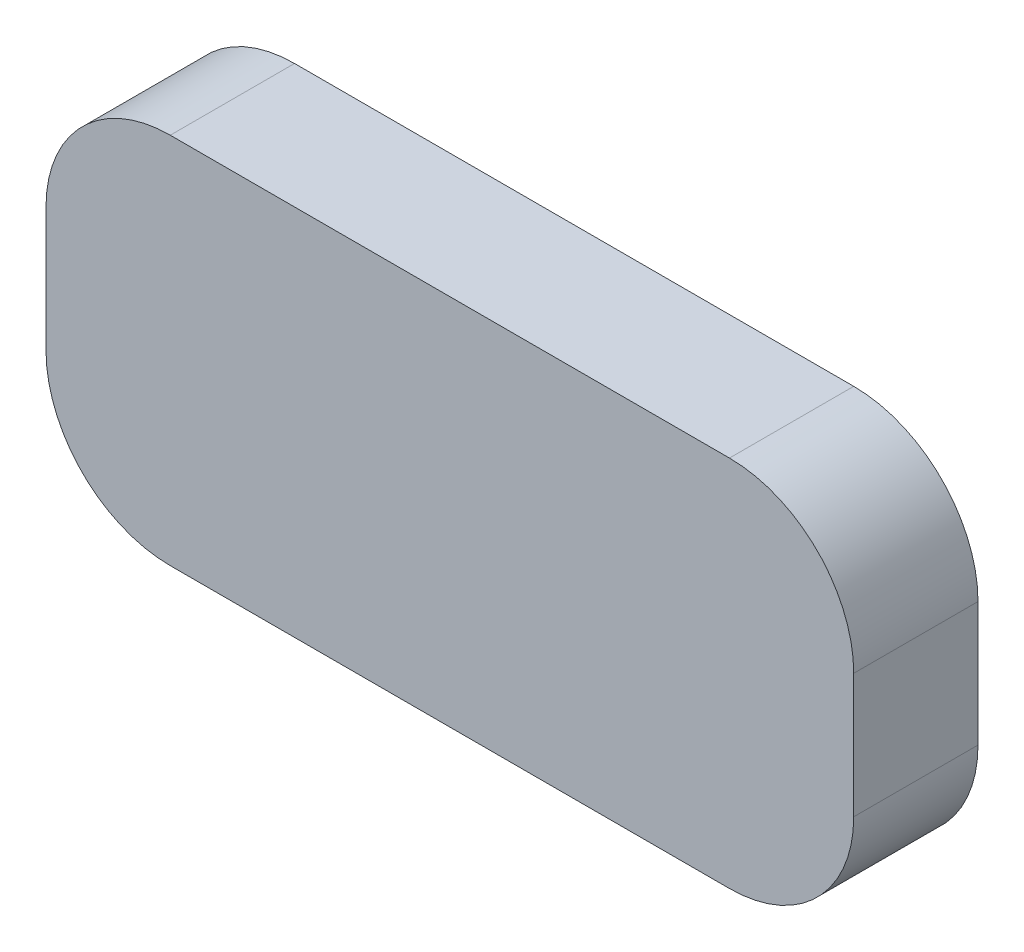
ISO-10303-21;
HEADER;
FILE_DESCRIPTION(('STEP AP214'),'2;1');
FILE_NAME('part.step','',(''),(''),'','','');
FILE_SCHEMA(('AUTOMOTIVE_DESIGN { 1 0 10303 214 1 1 1 1 }'));
ENDSEC;
DATA;
#1=APPLICATION_CONTEXT('core data for automotive mechanical design processes');
#2=APPLICATION_PROTOCOL_DEFINITION('international standard','automotive_design',2000,#1);
#3=PRODUCT_CONTEXT('',#1,'mechanical');
#4=PRODUCT('Part','Part','',(#3));
#5=PRODUCT_RELATED_PRODUCT_CATEGORY('part','',(#4));
#6=PRODUCT_DEFINITION_FORMATION('','',#4);
#7=PRODUCT_DEFINITION_CONTEXT('part definition',#1,'design');
#8=PRODUCT_DEFINITION('design','',#6,#7);
#9=PRODUCT_DEFINITION_SHAPE('','',#8);
#10=(LENGTH_UNIT() NAMED_UNIT(*) SI_UNIT(.MILLI.,.METRE.));
#11=(NAMED_UNIT(*) PLANE_ANGLE_UNIT() SI_UNIT($,.RADIAN.));
#12=(NAMED_UNIT(*) SI_UNIT($,.STERADIAN.) SOLID_ANGLE_UNIT());
#13=UNCERTAINTY_MEASURE_WITH_UNIT(LENGTH_MEASURE(1.E-05),#10,'distance_accuracy_value','');
#14=(GEOMETRIC_REPRESENTATION_CONTEXT(3) GLOBAL_UNCERTAINTY_ASSIGNED_CONTEXT((#13)) GLOBAL_UNIT_ASSIGNED_CONTEXT((#10,
#11,#12)) REPRESENTATION_CONTEXT('',''));
#15=CARTESIAN_POINT('',(0.,0.,0.));
#16=DIRECTION('',(0.,0.,1.));
#17=DIRECTION('',(1.,0.,0.));
#18=AXIS2_PLACEMENT_3D('',#15,#16,#17);
#19=CARTESIAN_POINT('',(-36.8787133529713,-11.2655453718116,10.));
#20=DIRECTION('',(0.,0.,-1.));
#21=DIRECTION('',(-1.,0.,0.));
#22=AXIS2_PLACEMENT_3D('',#19,#20,#21);
#23=CYLINDRICAL_SURFACE('',#22,10.);
#24=CARTESIAN_POINT('',(-36.8787133529713,-11.2655453718116,0.));
#25=DIRECTION('',(0.,0.,1.));
#26=DIRECTION('',(1.,0.,0.));
#27=AXIS2_PLACEMENT_3D('',#24,#25,#26);
#28=CIRCLE('',#27,10.);
#29=CARTESIAN_POINT('',(-46.8787133529713,-11.2655453718115,0.));
#30=VERTEX_POINT('',#29);
#31=CARTESIAN_POINT('',(-36.8787133529712,-21.2655453718116,0.));
#32=VERTEX_POINT('',#31);
#33=EDGE_CURVE('E129',#30,#32,#28,.T.);
#34=ORIENTED_EDGE('',*,*,#33,.T.);
#35=DIRECTION('',(0.,0.,-1.));
#36=VECTOR('',#35,1.);
#37=CARTESIAN_POINT('',(-36.8787133529712,-21.2655453718116,10.));
#38=LINE('',#37,#36);
#39=CARTESIAN_POINT('',(-36.8787133529712,-21.2655453718116,10.));
#40=VERTEX_POINT('',#39);
#41=EDGE_CURVE('E11',#40,#32,#38,.T.);
#42=ORIENTED_EDGE('',*,*,#41,.F.);
#43=CARTESIAN_POINT('',(-36.8787133529713,-11.2655453718116,10.));
#44=DIRECTION('',(0.,0.,1.));
#45=DIRECTION('',(1.,0.,0.));
#46=AXIS2_PLACEMENT_3D('',#43,#44,#45);
#47=CIRCLE('',#46,10.);
#48=CARTESIAN_POINT('',(-46.8787133529713,-11.2655453718115,10.));
#49=VERTEX_POINT('',#48);
#50=EDGE_CURVE('E143',#49,#40,#47,.T.);
#51=ORIENTED_EDGE('',*,*,#50,.F.);
#52=DIRECTION('',(0.,0.,-1.));
#53=VECTOR('',#52,1.);
#54=CARTESIAN_POINT('',(-46.8787133529713,-11.2655453718115,10.));
#55=LINE('',#54,#53);
#56=EDGE_CURVE('E125',#49,#30,#55,.T.);
#57=ORIENTED_EDGE('',*,*,#56,.T.);
#58=EDGE_LOOP('',(#34,#42,#51,#57));
#59=FACE_BOUND('',#58,.T.);
#60=ADVANCED_FACE('F33',(#59),#23,.T.);
#61=CARTESIAN_POINT('',(-36.8787133529712,-21.2655453718116,10.));
#62=DIRECTION('',(0.,1.,0.));
#63=DIRECTION('',(0.,0.,1.));
#64=AXIS2_PLACEMENT_3D('',#61,#62,#63);
#65=PLANE('',#64);
#66=DIRECTION('',(1.,0.,0.));
#67=VECTOR('',#66,1.);
#68=CARTESIAN_POINT('',(-36.8787133529712,-21.2655453718116,0.));
#69=LINE('',#68,#67);
#70=CARTESIAN_POINT('',(8.12128664702875,-21.2655453718116,0.));
#71=VERTEX_POINT('',#70);
#72=EDGE_CURVE('E132',#32,#71,#69,.T.);
#73=ORIENTED_EDGE('',*,*,#72,.T.);
#74=DIRECTION('',(0.,0.,-1.));
#75=VECTOR('',#74,1.);
#76=CARTESIAN_POINT('',(8.12128664702875,-21.2655453718116,10.));
#77=LINE('',#76,#75);
#78=CARTESIAN_POINT('',(8.12128664702875,-21.2655453718116,10.));
#79=VERTEX_POINT('',#78);
#80=EDGE_CURVE('E41',#79,#71,#77,.T.);
#81=ORIENTED_EDGE('',*,*,#80,.F.);
#82=DIRECTION('',(1.,0.,0.));
#83=VECTOR('',#82,1.);
#84=CARTESIAN_POINT('',(-36.8787133529712,-21.2655453718116,10.));
#85=LINE('',#84,#83);
#86=EDGE_CURVE('E92',#40,#79,#85,.T.);
#87=ORIENTED_EDGE('',*,*,#86,.F.);
#88=ORIENTED_EDGE('',*,*,#41,.T.);
#89=EDGE_LOOP('',(#73,#81,#87,#88));
#90=FACE_BOUND('',#89,.T.);
#91=ADVANCED_FACE('F178',(#90),#65,.F.);
#92=CARTESIAN_POINT('',(8.12128664702875,-11.2655453718115,10.));
#93=DIRECTION('',(0.,0.,-1.));
#94=DIRECTION('',(-1.,0.,0.));
#95=AXIS2_PLACEMENT_3D('',#92,#93,#94);
#96=CYLINDRICAL_SURFACE('',#95,10.);
#97=CARTESIAN_POINT('',(8.12128664702875,-11.2655453718115,0.));
#98=DIRECTION('',(0.,0.,1.));
#99=DIRECTION('',(1.,0.,0.));
#100=AXIS2_PLACEMENT_3D('',#97,#98,#99);
#101=CIRCLE('',#100,10.);
#102=CARTESIAN_POINT('',(18.1212866470288,-11.2655453718115,0.));
#103=VERTEX_POINT('',#102);
#104=EDGE_CURVE('E134',#71,#103,#101,.T.);
#105=ORIENTED_EDGE('',*,*,#104,.T.);
#106=DIRECTION('',(0.,0.,-1.));
#107=VECTOR('',#106,1.);
#108=CARTESIAN_POINT('',(18.1212866470288,-11.2655453718115,10.));
#109=LINE('',#108,#107);
#110=CARTESIAN_POINT('',(18.1212866470288,-11.2655453718115,10.));
#111=VERTEX_POINT('',#110);
#112=EDGE_CURVE('E150',#111,#103,#109,.T.);
#113=ORIENTED_EDGE('',*,*,#112,.F.);
#114=CARTESIAN_POINT('',(8.12128664702875,-11.2655453718115,10.));
#115=DIRECTION('',(0.,0.,1.));
#116=DIRECTION('',(1.,0.,0.));
#117=AXIS2_PLACEMENT_3D('',#114,#115,#116);
#118=CIRCLE('',#117,10.);
#119=EDGE_CURVE('E158',#79,#111,#118,.T.);
#120=ORIENTED_EDGE('',*,*,#119,.F.);
#121=ORIENTED_EDGE('',*,*,#80,.T.);
#122=EDGE_LOOP('',(#105,#113,#120,#121));
#123=FACE_BOUND('',#122,.T.);
#124=ADVANCED_FACE('F156',(#123),#96,.T.);
#125=CARTESIAN_POINT('',(18.1212866470287,-1.26554537181155,10.));
#126=DIRECTION('',(-1.,0.,0.));
#127=DIRECTION('',(0.,-1.,0.));
#128=AXIS2_PLACEMENT_3D('',#125,#126,#127);
#129=PLANE('',#128);
#130=DIRECTION('',(0.,1.,0.));
#131=VECTOR('',#130,1.);
#132=CARTESIAN_POINT('',(18.1212866470287,-1.26554537181155,0.));
#133=LINE('',#132,#131);
#134=CARTESIAN_POINT('',(18.1212866470287,-1.26554537181155,0.));
#135=VERTEX_POINT('',#134);
#136=EDGE_CURVE('E136',#103,#135,#133,.T.);
#137=ORIENTED_EDGE('',*,*,#136,.T.);
#138=DIRECTION('',(0.,0.,-1.));
#139=VECTOR('',#138,1.);
#140=CARTESIAN_POINT('',(18.1212866470287,-1.26554537181155,10.));
#141=LINE('',#140,#139);
#142=CARTESIAN_POINT('',(18.1212866470287,-1.26554537181155,10.));
#143=VERTEX_POINT('',#142);
#144=EDGE_CURVE('E147',#143,#135,#141,.T.);
#145=ORIENTED_EDGE('',*,*,#144,.F.);
#146=DIRECTION('',(0.,1.,0.));
#147=VECTOR('',#146,1.);
#148=CARTESIAN_POINT('',(18.1212866470287,-1.26554537181155,10.));
#149=LINE('',#148,#147);
#150=EDGE_CURVE('E170',#111,#143,#149,.T.);
#151=ORIENTED_EDGE('',*,*,#150,.F.);
#152=ORIENTED_EDGE('',*,*,#112,.T.);
#153=EDGE_LOOP('',(#137,#145,#151,#152));
#154=FACE_BOUND('',#153,.T.);
#155=ADVANCED_FACE('F166',(#154),#129,.F.);
#156=CARTESIAN_POINT('',(8.12128664702875,-1.26554537181155,10.));
#157=DIRECTION('',(0.,0.,-1.));
#158=DIRECTION('',(-1.,0.,0.));
#159=AXIS2_PLACEMENT_3D('',#156,#157,#158);
#160=CYLINDRICAL_SURFACE('',#159,10.);
#161=CARTESIAN_POINT('',(8.12128664702875,-1.26554537181155,0.));
#162=DIRECTION('',(0.,0.,1.));
#163=DIRECTION('',(1.,0.,0.));
#164=AXIS2_PLACEMENT_3D('',#161,#162,#163);
#165=CIRCLE('',#164,10.);
#166=CARTESIAN_POINT('',(8.12128664702875,8.73445462818845,0.));
#167=VERTEX_POINT('',#166);
#168=EDGE_CURVE('E138',#135,#167,#165,.T.);
#169=ORIENTED_EDGE('',*,*,#168,.T.);
#170=DIRECTION('',(0.,0.,-1.));
#171=VECTOR('',#170,1.);
#172=CARTESIAN_POINT('',(8.12128664702875,8.73445462818845,10.));
#173=LINE('',#172,#171);
#174=CARTESIAN_POINT('',(8.12128664702875,8.73445462818845,10.));
#175=VERTEX_POINT('',#174);
#176=EDGE_CURVE('E120',#175,#167,#173,.T.);
#177=ORIENTED_EDGE('',*,*,#176,.F.);
#178=CARTESIAN_POINT('',(8.12128664702875,-1.26554537181155,10.));
#179=DIRECTION('',(0.,0.,1.));
#180=DIRECTION('',(1.,0.,0.));
#181=AXIS2_PLACEMENT_3D('',#178,#179,#180);
#182=CIRCLE('',#181,10.);
#183=EDGE_CURVE('E111',#143,#175,#182,.T.);
#184=ORIENTED_EDGE('',*,*,#183,.F.);
#185=ORIENTED_EDGE('',*,*,#144,.T.);
#186=EDGE_LOOP('',(#169,#177,#184,#185));
#187=FACE_BOUND('',#186,.T.);
#188=ADVANCED_FACE('F169',(#187),#160,.T.);
#189=CARTESIAN_POINT('',(-36.8787133529712,8.73445462818845,10.));
#190=DIRECTION('',(0.,-1.,0.));
#191=DIRECTION('',(0.,0.,-1.));
#192=AXIS2_PLACEMENT_3D('',#189,#190,#191);
#193=PLANE('',#192);
#194=DIRECTION('',(-1.,0.,0.));
#195=VECTOR('',#194,1.);
#196=CARTESIAN_POINT('',(-36.8787133529712,8.73445462818845,0.));
#197=LINE('',#196,#195);
#198=CARTESIAN_POINT('',(-36.8787133529712,8.73445462818845,0.));
#199=VERTEX_POINT('',#198);
#200=EDGE_CURVE('E119',#167,#199,#197,.T.);
#201=ORIENTED_EDGE('',*,*,#200,.T.);
#202=DIRECTION('',(0.,0.,-1.));
#203=VECTOR('',#202,1.);
#204=CARTESIAN_POINT('',(-36.8787133529712,8.73445462818845,10.));
#205=LINE('',#204,#203);
#206=CARTESIAN_POINT('',(-36.8787133529712,8.73445462818845,10.));
#207=VERTEX_POINT('',#206);
#208=EDGE_CURVE('E116',#207,#199,#205,.T.);
#209=ORIENTED_EDGE('',*,*,#208,.F.);
#210=DIRECTION('',(-1.,0.,0.));
#211=VECTOR('',#210,1.);
#212=CARTESIAN_POINT('',(-36.8787133529712,8.73445462818845,10.));
#213=LINE('',#212,#211);
#214=EDGE_CURVE('E105',#175,#207,#213,.T.);
#215=ORIENTED_EDGE('',*,*,#214,.F.);
#216=ORIENTED_EDGE('',*,*,#176,.T.);
#217=EDGE_LOOP('',(#201,#209,#215,#216));
#218=FACE_BOUND('',#217,.T.);
#219=ADVANCED_FACE('F117',(#218),#193,.F.);
#220=CARTESIAN_POINT('',(-36.8787133529713,-1.26554537181155,10.));
#221=DIRECTION('',(0.,0.,-1.));
#222=DIRECTION('',(-1.,0.,0.));
#223=AXIS2_PLACEMENT_3D('',#220,#221,#222);
#224=CYLINDRICAL_SURFACE('',#223,10.);
#225=CARTESIAN_POINT('',(-36.8787133529713,-1.26554537181155,0.));
#226=DIRECTION('',(0.,0.,1.));
#227=DIRECTION('',(1.,0.,0.));
#228=AXIS2_PLACEMENT_3D('',#225,#226,#227);
#229=CIRCLE('',#228,10.);
#230=CARTESIAN_POINT('',(-46.8787133529713,-1.26554537181162,0.));
#231=VERTEX_POINT('',#230);
#232=EDGE_CURVE('E78',#199,#231,#229,.T.);
#233=ORIENTED_EDGE('',*,*,#232,.T.);
#234=DIRECTION('',(0.,0.,-1.));
#235=VECTOR('',#234,1.);
#236=CARTESIAN_POINT('',(-46.8787133529713,-1.26554537181162,10.));
#237=LINE('',#236,#235);
#238=CARTESIAN_POINT('',(-46.8787133529713,-1.26554537181162,10.));
#239=VERTEX_POINT('',#238);
#240=EDGE_CURVE('E121',#239,#231,#237,.T.);
#241=ORIENTED_EDGE('',*,*,#240,.F.);
#242=CARTESIAN_POINT('',(-36.8787133529713,-1.26554537181155,10.));
#243=DIRECTION('',(0.,0.,1.));
#244=DIRECTION('',(1.,0.,0.));
#245=AXIS2_PLACEMENT_3D('',#242,#243,#244);
#246=CIRCLE('',#245,10.);
#247=EDGE_CURVE('E109',#207,#239,#246,.T.);
#248=ORIENTED_EDGE('',*,*,#247,.F.);
#249=ORIENTED_EDGE('',*,*,#208,.T.);
#250=EDGE_LOOP('',(#233,#241,#248,#249));
#251=FACE_BOUND('',#250,.T.);
#252=ADVANCED_FACE('F123',(#251),#224,.T.);
#253=CARTESIAN_POINT('',(-46.8787133529713,-1.26554537181162,10.));
#254=DIRECTION('',(1.,0.,0.));
#255=DIRECTION('',(0.,0.,-1.));
#256=AXIS2_PLACEMENT_3D('',#253,#254,#255);
#257=PLANE('',#256);
#258=DIRECTION('',(0.,-1.,0.));
#259=VECTOR('',#258,1.);
#260=CARTESIAN_POINT('',(-46.8787133529713,-1.26554537181162,0.));
#261=LINE('',#260,#259);
#262=EDGE_CURVE('E84',#231,#30,#261,.T.);
#263=ORIENTED_EDGE('',*,*,#262,.T.);
#264=ORIENTED_EDGE('',*,*,#56,.F.);
#265=DIRECTION('',(0.,-1.,0.));
#266=VECTOR('',#265,1.);
#267=CARTESIAN_POINT('',(-46.8787133529713,-1.26554537181162,10.));
#268=LINE('',#267,#266);
#269=EDGE_CURVE('E49',#239,#49,#268,.T.);
#270=ORIENTED_EDGE('',*,*,#269,.F.);
#271=ORIENTED_EDGE('',*,*,#240,.T.);
#272=EDGE_LOOP('',(#263,#264,#270,#271));
#273=FACE_BOUND('',#272,.T.);
#274=ADVANCED_FACE('F194',(#273),#257,.F.);
#275=CARTESIAN_POINT('',(-36.8787133529713,-11.2655453718116,10.));
#276=DIRECTION('',(0.,0.,1.));
#277=DIRECTION('',(1.,0.,0.));
#278=AXIS2_PLACEMENT_3D('',#275,#276,#277);
#279=PLANE('',#278);
#280=ORIENTED_EDGE('',*,*,#50,.T.);
#281=ORIENTED_EDGE('',*,*,#86,.T.);
#282=ORIENTED_EDGE('',*,*,#119,.T.);
#283=ORIENTED_EDGE('',*,*,#150,.T.);
#284=ORIENTED_EDGE('',*,*,#183,.T.);
#285=ORIENTED_EDGE('',*,*,#214,.T.);
#286=ORIENTED_EDGE('',*,*,#247,.T.);
#287=ORIENTED_EDGE('',*,*,#269,.T.);
#288=EDGE_LOOP('',(#280,#281,#282,#283,#284,#285,#286,#287));
#289=FACE_BOUND('',#288,.T.);
#290=ADVANCED_FACE('F107',(#289),#279,.T.);
#291=CARTESIAN_POINT('',(-36.8787133529713,-11.2655453718116,0.));
#292=DIRECTION('',(0.,0.,1.));
#293=DIRECTION('',(1.,0.,0.));
#294=AXIS2_PLACEMENT_3D('',#291,#292,#293);
#295=PLANE('',#294);
#296=ORIENTED_EDGE('',*,*,#33,.F.);
#297=ORIENTED_EDGE('',*,*,#262,.F.);
#298=ORIENTED_EDGE('',*,*,#232,.F.);
#299=ORIENTED_EDGE('',*,*,#200,.F.);
#300=ORIENTED_EDGE('',*,*,#168,.F.);
#301=ORIENTED_EDGE('',*,*,#136,.F.);
#302=ORIENTED_EDGE('',*,*,#104,.F.);
#303=ORIENTED_EDGE('',*,*,#72,.F.);
#304=EDGE_LOOP('',(#296,#297,#298,#299,#300,#301,#302,#303));
#305=FACE_BOUND('',#304,.T.);
#306=ADVANCED_FACE('F162',(#305),#295,.F.);
#307=CLOSED_SHELL('',(#60,#91,#124,#155,#188,#219,#252,#274,#290,#306));
#308=MANIFOLD_SOLID_BREP('B2',#307);
#309=ADVANCED_BREP_SHAPE_REPRESENTATION('',(#18,#308),#14);
#310=SHAPE_DEFINITION_REPRESENTATION(#9,#309);
ENDSEC;
END-ISO-10303-21;
